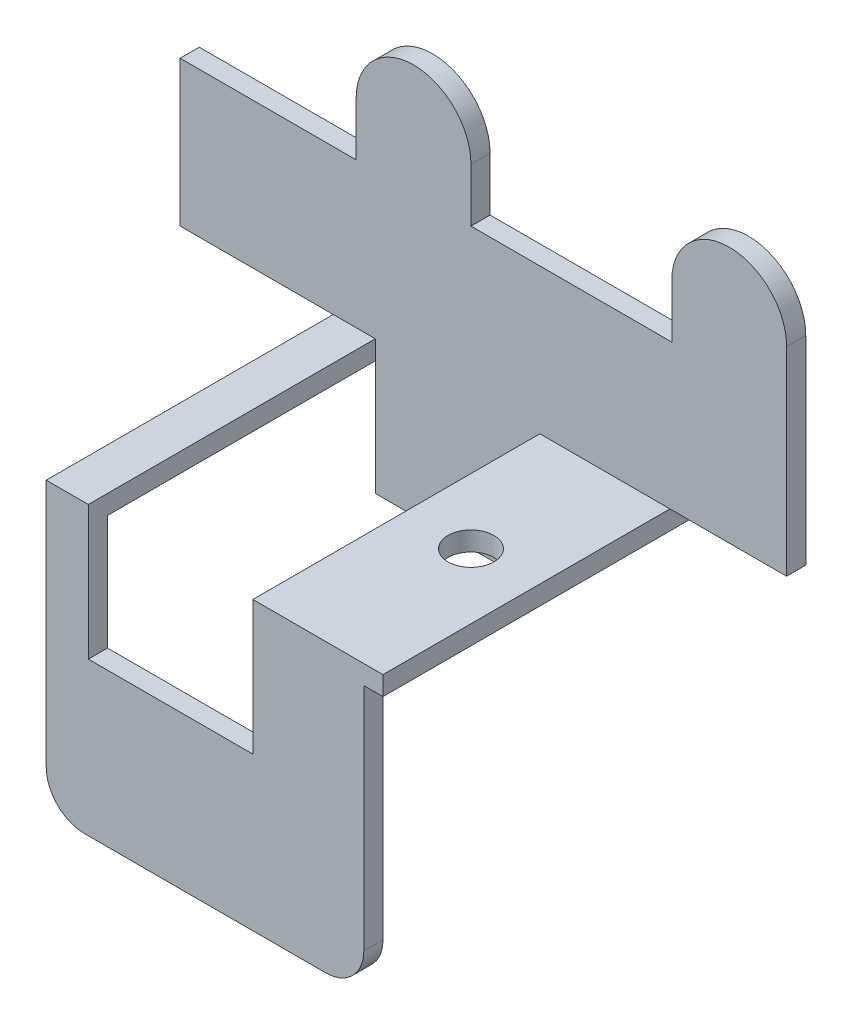
ISO-10303-21;
HEADER;
FILE_DESCRIPTION(('STEP AP214'),'2;1');
FILE_NAME('part.step','',(''),(''),'','','');
FILE_SCHEMA(('AUTOMOTIVE_DESIGN { 1 0 10303 214 1 1 1 1 }'));
ENDSEC;
DATA;
#1=APPLICATION_CONTEXT('core data for automotive mechanical design processes');
#2=APPLICATION_PROTOCOL_DEFINITION('international standard','automotive_design',2000,#1);
#3=PRODUCT_CONTEXT('',#1,'mechanical');
#4=PRODUCT('Part','Part','',(#3));
#5=PRODUCT_RELATED_PRODUCT_CATEGORY('part','',(#4));
#6=PRODUCT_DEFINITION_FORMATION('','',#4);
#7=PRODUCT_DEFINITION_CONTEXT('part definition',#1,'design');
#8=PRODUCT_DEFINITION('design','',#6,#7);
#9=PRODUCT_DEFINITION_SHAPE('','',#8);
#10=(LENGTH_UNIT() NAMED_UNIT(*) SI_UNIT(.MILLI.,.METRE.));
#11=(NAMED_UNIT(*) PLANE_ANGLE_UNIT() SI_UNIT($,.RADIAN.));
#12=(NAMED_UNIT(*) SI_UNIT($,.STERADIAN.) SOLID_ANGLE_UNIT());
#13=UNCERTAINTY_MEASURE_WITH_UNIT(LENGTH_MEASURE(1.E-05),#10,'distance_accuracy_value','');
#14=(GEOMETRIC_REPRESENTATION_CONTEXT(3) GLOBAL_UNCERTAINTY_ASSIGNED_CONTEXT((#13)) GLOBAL_UNIT_ASSIGNED_CONTEXT((#10,
#11,#12)) REPRESENTATION_CONTEXT('',''));
#15=CARTESIAN_POINT('',(0.,0.,0.));
#16=DIRECTION('',(0.,0.,1.));
#17=DIRECTION('',(1.,0.,0.));
#18=AXIS2_PLACEMENT_3D('',#15,#16,#17);
#19=CARTESIAN_POINT('',(23.876,-1.27,20.32));
#20=DIRECTION('',(0.,1.,0.));
#21=DIRECTION('',(0.,0.,1.));
#22=AXIS2_PLACEMENT_3D('',#19,#20,#21);
#23=PLANE('',#22);
#24=CARTESIAN_POINT('',(28.194,-1.27,10.16));
#25=DIRECTION('',(0.,-1.,0.));
#26=DIRECTION('',(0.,0.,-1.));
#27=AXIS2_PLACEMENT_3D('',#24,#25,#26);
#28=CIRCLE('',#27,1.524);
#29=CARTESIAN_POINT('',(28.194,-1.27,8.636));
#30=VERTEX_POINT('',#29);
#31=EDGE_CURVE('E640',#30,#30,#28,.T.);
#32=ORIENTED_EDGE('',*,*,#31,.F.);
#33=EDGE_LOOP('',(#32));
#34=FACE_BOUND('',#33,.T.);
#35=DIRECTION('',(1.,0.,0.));
#36=VECTOR('',#35,1.);
#37=CARTESIAN_POINT('',(23.876,-1.27000000000001,19.05));
#38=LINE('',#37,#36);
#39=CARTESIAN_POINT('',(23.876,-1.27000000000001,19.05));
#40=VERTEX_POINT('',#39);
#41=CARTESIAN_POINT('',(31.242,-1.27000000000001,19.05));
#42=VERTEX_POINT('',#41);
#43=EDGE_CURVE('E273',#40,#42,#38,.T.);
#44=ORIENTED_EDGE('',*,*,#43,.F.);
#45=DIRECTION('',(0.,0.,-1.));
#46=VECTOR('',#45,1.);
#47=CARTESIAN_POINT('',(23.876,-1.27,20.32));
#48=LINE('',#47,#46);
#49=CARTESIAN_POINT('',(23.876,-1.27,1.27));
#50=VERTEX_POINT('',#49);
#51=EDGE_CURVE('E346',#40,#50,#48,.T.);
#52=ORIENTED_EDGE('',*,*,#51,.T.);
#53=CARTESIAN_POINT('',(23.876,-1.27,0.));
#54=VERTEX_POINT('',#53);
#55=EDGE_CURVE('E345',#50,#54,#48,.T.);
#56=ORIENTED_EDGE('',*,*,#55,.T.);
#57=DIRECTION('',(1.,0.,0.));
#58=VECTOR('',#57,1.);
#59=CARTESIAN_POINT('',(23.876,-1.27,0.));
#60=LINE('',#59,#58);
#61=CARTESIAN_POINT('',(32.512,-1.27,0.));
#62=VERTEX_POINT('',#61);
#63=EDGE_CURVE('E326',#54,#62,#60,.T.);
#64=ORIENTED_EDGE('',*,*,#63,.T.);
#65=DIRECTION('',(0.,0.,-1.));
#66=VECTOR('',#65,1.);
#67=CARTESIAN_POINT('',(32.512,-1.27,20.32));
#68=LINE('',#67,#66);
#69=CARTESIAN_POINT('',(32.512,-1.27,20.32));
#70=VERTEX_POINT('',#69);
#71=EDGE_CURVE('E342',#70,#62,#68,.T.);
#72=ORIENTED_EDGE('',*,*,#71,.F.);
#73=DIRECTION('',(1.,0.,0.));
#74=VECTOR('',#73,1.);
#75=CARTESIAN_POINT('',(23.876,-1.27,20.32));
#76=LINE('',#75,#74);
#77=CARTESIAN_POINT('',(31.242,-1.27,20.32));
#78=VERTEX_POINT('',#77);
#79=EDGE_CURVE('E283',#78,#70,#76,.T.);
#80=ORIENTED_EDGE('',*,*,#79,.F.);
#81=DIRECTION('',(0.,0.,1.));
#82=VECTOR('',#81,1.);
#83=CARTESIAN_POINT('',(31.242,-1.27000000000001,20.32));
#84=LINE('',#83,#82);
#85=EDGE_CURVE('E232',#42,#78,#84,.T.);
#86=ORIENTED_EDGE('',*,*,#85,.F.);
#87=EDGE_LOOP('',(#44,#52,#56,#64,#72,#80,#86));
#88=FACE_BOUND('',#87,.T.);
#89=ADVANCED_FACE('F32',(#34,#88),#23,.F.);
#90=CARTESIAN_POINT('',(12.954,-1.27,20.32));
#91=DIRECTION('',(0.,1.,0.));
#92=DIRECTION('',(-1.,0.,0.));
#93=AXIS2_PLACEMENT_3D('',#90,#91,#92);
#94=PLANE('',#93);
#95=DIRECTION('',(1.,0.,0.));
#96=VECTOR('',#95,1.);
#97=CARTESIAN_POINT('',(10.16,-1.27,19.05));
#98=LINE('',#97,#96);
#99=CARTESIAN_POINT('',(10.16,-1.27,19.05));
#100=VERTEX_POINT('',#99);
#101=CARTESIAN_POINT('',(12.954,-1.27,19.05));
#102=VERTEX_POINT('',#101);
#103=EDGE_CURVE('E292',#100,#102,#98,.T.);
#104=ORIENTED_EDGE('',*,*,#103,.F.);
#105=DIRECTION('',(0.,0.,-1.));
#106=VECTOR('',#105,1.);
#107=CARTESIAN_POINT('',(10.16,-1.27,20.32));
#108=LINE('',#107,#106);
#109=CARTESIAN_POINT('',(10.16,-1.27,0.));
#110=VERTEX_POINT('',#109);
#111=EDGE_CURVE('E314',#100,#110,#108,.T.);
#112=ORIENTED_EDGE('',*,*,#111,.T.);
#113=DIRECTION('',(1.,0.,0.));
#114=VECTOR('',#113,1.);
#115=CARTESIAN_POINT('',(12.954,-1.27,0.));
#116=LINE('',#115,#114);
#117=CARTESIAN_POINT('',(12.954,-1.27,0.));
#118=VERTEX_POINT('',#117);
#119=EDGE_CURVE('E310',#110,#118,#116,.T.);
#120=ORIENTED_EDGE('',*,*,#119,.T.);
#121=DIRECTION('',(0.,0.,-1.));
#122=VECTOR('',#121,1.);
#123=CARTESIAN_POINT('',(12.954,-1.27,20.32));
#124=LINE('',#123,#122);
#125=CARTESIAN_POINT('',(12.954,-1.27,1.27));
#126=VERTEX_POINT('',#125);
#127=EDGE_CURVE('E307',#126,#118,#124,.T.);
#128=ORIENTED_EDGE('',*,*,#127,.F.);
#129=EDGE_CURVE('E57',#102,#126,#124,.T.);
#130=ORIENTED_EDGE('',*,*,#129,.F.);
#131=EDGE_LOOP('',(#104,#112,#120,#128,#130));
#132=FACE_BOUND('',#131,.T.);
#133=ADVANCED_FACE('F480',(#132),#94,.F.);
#134=CARTESIAN_POINT('',(12.954,0.,1.27));
#135=DIRECTION('',(0.,1.,0.));
#136=DIRECTION('',(-1.,0.,0.));
#137=AXIS2_PLACEMENT_3D('',#134,#135,#136);
#138=PLANE('',#137);
#139=DIRECTION('',(0.,0.,-1.));
#140=VECTOR('',#139,1.);
#141=CARTESIAN_POINT('',(10.16,0.,20.32));
#142=LINE('',#141,#140);
#143=CARTESIAN_POINT('',(10.16,0.,1.27));
#144=VERTEX_POINT('',#143);
#145=CARTESIAN_POINT('',(10.16,0.,0.));
#146=VERTEX_POINT('',#145);
#147=EDGE_CURVE('E316',#144,#146,#142,.T.);
#148=ORIENTED_EDGE('',*,*,#147,.F.);
#149=DIRECTION('',(1.,0.,0.));
#150=VECTOR('',#149,1.);
#151=CARTESIAN_POINT('',(12.954,0.,1.27));
#152=LINE('',#151,#150);
#153=CARTESIAN_POINT('',(0.,0.,1.27));
#154=VERTEX_POINT('',#153);
#155=EDGE_CURVE('E352',#154,#144,#152,.T.);
#156=ORIENTED_EDGE('',*,*,#155,.F.);
#157=DIRECTION('',(0.,0.,-1.));
#158=VECTOR('',#157,1.);
#159=CARTESIAN_POINT('',(0.,0.,1.27));
#160=LINE('',#159,#158);
#161=CARTESIAN_POINT('',(0.,0.,0.));
#162=VERTEX_POINT('',#161);
#163=EDGE_CURVE('E387',#154,#162,#160,.T.);
#164=ORIENTED_EDGE('',*,*,#163,.T.);
#165=DIRECTION('',(1.,0.,0.));
#166=VECTOR('',#165,1.);
#167=CARTESIAN_POINT('',(12.954,0.,0.));
#168=LINE('',#167,#166);
#169=EDGE_CURVE('E351',#162,#146,#168,.T.);
#170=ORIENTED_EDGE('',*,*,#169,.T.);
#171=EDGE_LOOP('',(#148,#156,#164,#170));
#172=FACE_BOUND('',#171,.T.);
#173=ADVANCED_FACE('F34',(#172),#138,.F.);
#174=CARTESIAN_POINT('',(12.954,-8.89,1.27));
#175=DIRECTION('',(1.,0.,0.));
#176=DIRECTION('',(0.,0.,-1.));
#177=AXIS2_PLACEMENT_3D('',#174,#175,#176);
#178=PLANE('',#177);
#179=ORIENTED_EDGE('',*,*,#127,.T.);
#180=DIRECTION('',(0.,-1.,0.));
#181=VECTOR('',#180,1.);
#182=CARTESIAN_POINT('',(12.954,-8.89,0.));
#183=LINE('',#182,#181);
#184=CARTESIAN_POINT('',(12.954,-8.89,0.));
#185=VERTEX_POINT('',#184);
#186=EDGE_CURVE('E389',#118,#185,#183,.T.);
#187=ORIENTED_EDGE('',*,*,#186,.T.);
#188=DIRECTION('',(0.,0.,-1.));
#189=VECTOR('',#188,1.);
#190=CARTESIAN_POINT('',(12.954,-8.89,1.27));
#191=LINE('',#190,#189);
#192=CARTESIAN_POINT('',(12.954,-8.89,1.27));
#193=VERTEX_POINT('',#192);
#194=EDGE_CURVE('E11',#193,#185,#191,.T.);
#195=ORIENTED_EDGE('',*,*,#194,.F.);
#196=DIRECTION('',(0.,-1.,0.));
#197=VECTOR('',#196,1.);
#198=CARTESIAN_POINT('',(12.954,-8.89,1.27));
#199=LINE('',#198,#197);
#200=EDGE_CURVE('E355',#126,#193,#199,.T.);
#201=ORIENTED_EDGE('',*,*,#200,.F.);
#202=EDGE_LOOP('',(#179,#187,#195,#201));
#203=FACE_BOUND('',#202,.T.);
#204=ADVANCED_FACE('F549',(#203),#178,.F.);
#205=CARTESIAN_POINT('',(23.876,0.,1.27));
#206=DIRECTION('',(-1.,0.,0.));
#207=DIRECTION('',(0.,0.,1.));
#208=AXIS2_PLACEMENT_3D('',#205,#206,#207);
#209=PLANE('',#208);
#210=ORIENTED_EDGE('',*,*,#55,.F.);
#211=DIRECTION('',(0.,1.,0.));
#212=VECTOR('',#211,1.);
#213=CARTESIAN_POINT('',(23.876,0.,1.27));
#214=LINE('',#213,#212);
#215=CARTESIAN_POINT('',(23.876,-8.89,1.27));
#216=VERTEX_POINT('',#215);
#217=EDGE_CURVE('E362',#216,#50,#214,.T.);
#218=ORIENTED_EDGE('',*,*,#217,.F.);
#219=DIRECTION('',(0.,0.,-1.));
#220=VECTOR('',#219,1.);
#221=CARTESIAN_POINT('',(23.876,-8.89,1.27));
#222=LINE('',#221,#220);
#223=CARTESIAN_POINT('',(23.876,-8.89,0.));
#224=VERTEX_POINT('',#223);
#225=EDGE_CURVE('E41',#216,#224,#222,.T.);
#226=ORIENTED_EDGE('',*,*,#225,.T.);
#227=DIRECTION('',(0.,1.,0.));
#228=VECTOR('',#227,1.);
#229=CARTESIAN_POINT('',(23.876,0.,0.));
#230=LINE('',#229,#228);
#231=EDGE_CURVE('E393',#224,#54,#230,.T.);
#232=ORIENTED_EDGE('',*,*,#231,.T.);
#233=EDGE_LOOP('',(#210,#218,#226,#232));
#234=FACE_BOUND('',#233,.T.);
#235=ADVANCED_FACE('F545',(#234),#209,.F.);
#236=CARTESIAN_POINT('',(40.259,0.,1.27));
#237=DIRECTION('',(0.,1.,0.));
#238=DIRECTION('',(-1.,0.,0.));
#239=AXIS2_PLACEMENT_3D('',#236,#237,#238);
#240=PLANE('',#239);
#241=DIRECTION('',(0.,0.,-1.));
#242=VECTOR('',#241,1.);
#243=CARTESIAN_POINT('',(32.512,0.,20.32));
#244=LINE('',#243,#242);
#245=CARTESIAN_POINT('',(32.512,0.,1.27));
#246=VERTEX_POINT('',#245);
#247=CARTESIAN_POINT('',(32.512,0.,0.));
#248=VERTEX_POINT('',#247);
#249=EDGE_CURVE('E338',#246,#248,#244,.T.);
#250=ORIENTED_EDGE('',*,*,#249,.T.);
#251=DIRECTION('',(1.,0.,0.));
#252=VECTOR('',#251,1.);
#253=CARTESIAN_POINT('',(40.259,0.,0.));
#254=LINE('',#253,#252);
#255=CARTESIAN_POINT('',(40.259,0.,0.));
#256=VERTEX_POINT('',#255);
#257=EDGE_CURVE('E395',#248,#256,#254,.T.);
#258=ORIENTED_EDGE('',*,*,#257,.T.);
#259=DIRECTION('',(0.,0.,-1.));
#260=VECTOR('',#259,1.);
#261=CARTESIAN_POINT('',(40.259,0.,1.27));
#262=LINE('',#261,#260);
#263=CARTESIAN_POINT('',(40.259,0.,1.27));
#264=VERTEX_POINT('',#263);
#265=EDGE_CURVE('E440',#264,#256,#262,.T.);
#266=ORIENTED_EDGE('',*,*,#265,.F.);
#267=DIRECTION('',(1.,0.,0.));
#268=VECTOR('',#267,1.);
#269=CARTESIAN_POINT('',(40.259,0.,1.27));
#270=LINE('',#269,#268);
#271=EDGE_CURVE('E365',#246,#264,#270,.T.);
#272=ORIENTED_EDGE('',*,*,#271,.F.);
#273=EDGE_LOOP('',(#250,#258,#266,#272));
#274=FACE_BOUND('',#273,.T.);
#275=ADVANCED_FACE('F542',(#274),#240,.F.);
#276=CARTESIAN_POINT('',(23.876,-8.89,1.27));
#277=DIRECTION('',(0.,1.,0.));
#278=DIRECTION('',(-1.,0.,0.));
#279=AXIS2_PLACEMENT_3D('',#276,#277,#278);
#280=PLANE('',#279);
#281=DIRECTION('',(1.,0.,0.));
#282=VECTOR('',#281,1.);
#283=CARTESIAN_POINT('',(23.876,-8.89,0.));
#284=LINE('',#283,#282);
#285=EDGE_CURVE('E391',#185,#224,#284,.T.);
#286=ORIENTED_EDGE('',*,*,#285,.T.);
#287=ORIENTED_EDGE('',*,*,#225,.F.);
#288=DIRECTION('',(1.,0.,0.));
#289=VECTOR('',#288,1.);
#290=CARTESIAN_POINT('',(23.876,-8.89,1.27));
#291=LINE('',#290,#289);
#292=EDGE_CURVE('E360',#193,#216,#291,.T.);
#293=ORIENTED_EDGE('',*,*,#292,.F.);
#294=ORIENTED_EDGE('',*,*,#194,.T.);
#295=EDGE_LOOP('',(#286,#287,#293,#294));
#296=FACE_BOUND('',#295,.T.);
#297=ADVANCED_FACE('F540',(#296),#280,.F.);
#298=CARTESIAN_POINT('',(40.259,13.208,1.27));
#299=DIRECTION('',(-1.,0.,0.));
#300=DIRECTION('',(0.,-1.,0.));
#301=AXIS2_PLACEMENT_3D('',#298,#299,#300);
#302=PLANE('',#301);
#303=DIRECTION('',(0.,1.,0.));
#304=VECTOR('',#303,1.);
#305=CARTESIAN_POINT('',(40.259,13.208,0.));
#306=LINE('',#305,#304);
#307=CARTESIAN_POINT('',(40.259,13.208,0.));
#308=VERTEX_POINT('',#307);
#309=EDGE_CURVE('E397',#256,#308,#306,.T.);
#310=ORIENTED_EDGE('',*,*,#309,.T.);
#311=DIRECTION('',(0.,0.,-1.));
#312=VECTOR('',#311,1.);
#313=CARTESIAN_POINT('',(40.259,13.208,1.27));
#314=LINE('',#313,#312);
#315=CARTESIAN_POINT('',(40.259,13.208,1.27));
#316=VERTEX_POINT('',#315);
#317=EDGE_CURVE('E437',#316,#308,#314,.T.);
#318=ORIENTED_EDGE('',*,*,#317,.F.);
#319=DIRECTION('',(0.,1.,0.));
#320=VECTOR('',#319,1.);
#321=CARTESIAN_POINT('',(40.259,9.652,1.27));
#322=LINE('',#321,#320);
#323=EDGE_CURVE('E369',#264,#316,#322,.T.);
#324=ORIENTED_EDGE('',*,*,#323,.F.);
#325=ORIENTED_EDGE('',*,*,#265,.T.);
#326=EDGE_LOOP('',(#310,#318,#324,#325));
#327=FACE_BOUND('',#326,.T.);
#328=ADVANCED_FACE('F536',(#327),#302,.F.);
#329=CARTESIAN_POINT('',(36.449,13.208,1.27));
#330=DIRECTION('',(0.,0.,-1.));
#331=DIRECTION('',(-1.,0.,0.));
#332=AXIS2_PLACEMENT_3D('',#329,#330,#331);
#333=CYLINDRICAL_SURFACE('',#332,3.81);
#334=CARTESIAN_POINT('',(36.449,13.208,0.));
#335=DIRECTION('',(0.,0.,1.));
#336=DIRECTION('',(1.,0.,0.));
#337=AXIS2_PLACEMENT_3D('',#334,#335,#336);
#338=CIRCLE('',#337,3.81);
#339=CARTESIAN_POINT('',(32.639,13.208,0.));
#340=VERTEX_POINT('',#339);
#341=EDGE_CURVE('E399',#308,#340,#338,.T.);
#342=ORIENTED_EDGE('',*,*,#341,.T.);
#343=DIRECTION('',(0.,0.,-1.));
#344=VECTOR('',#343,1.);
#345=CARTESIAN_POINT('',(32.639,13.208,1.27));
#346=LINE('',#345,#344);
#347=CARTESIAN_POINT('',(32.639,13.208,1.27));
#348=VERTEX_POINT('',#347);
#349=EDGE_CURVE('E434',#348,#340,#346,.T.);
#350=ORIENTED_EDGE('',*,*,#349,.F.);
#351=CARTESIAN_POINT('',(36.449,13.208,1.27));
#352=DIRECTION('',(0.,0.,1.));
#353=DIRECTION('',(1.,0.,0.));
#354=AXIS2_PLACEMENT_3D('',#351,#352,#353);
#355=CIRCLE('',#354,3.81);
#356=EDGE_CURVE('E371',#316,#348,#355,.T.);
#357=ORIENTED_EDGE('',*,*,#356,.F.);
#358=ORIENTED_EDGE('',*,*,#317,.T.);
#359=EDGE_LOOP('',(#342,#350,#357,#358));
#360=FACE_BOUND('',#359,.T.);
#361=ADVANCED_FACE('F532',(#360),#333,.T.);
#362=CARTESIAN_POINT('',(32.639,13.208,1.27));
#363=DIRECTION('',(1.,0.,0.));
#364=DIRECTION('',(0.,0.,-1.));
#365=AXIS2_PLACEMENT_3D('',#362,#363,#364);
#366=PLANE('',#365);
#367=DIRECTION('',(0.,-1.,0.));
#368=VECTOR('',#367,1.);
#369=CARTESIAN_POINT('',(32.639,13.208,0.));
#370=LINE('',#369,#368);
#371=CARTESIAN_POINT('',(32.639,9.652,0.));
#372=VERTEX_POINT('',#371);
#373=EDGE_CURVE('E401',#340,#372,#370,.T.);
#374=ORIENTED_EDGE('',*,*,#373,.T.);
#375=DIRECTION('',(0.,0.,-1.));
#376=VECTOR('',#375,1.);
#377=CARTESIAN_POINT('',(32.639,9.652,1.27));
#378=LINE('',#377,#376);
#379=CARTESIAN_POINT('',(32.639,9.652,1.27));
#380=VERTEX_POINT('',#379);
#381=EDGE_CURVE('E431',#380,#372,#378,.T.);
#382=ORIENTED_EDGE('',*,*,#381,.F.);
#383=DIRECTION('',(0.,-1.,0.));
#384=VECTOR('',#383,1.);
#385=CARTESIAN_POINT('',(32.639,13.208,1.27));
#386=LINE('',#385,#384);
#387=EDGE_CURVE('E373',#348,#380,#386,.T.);
#388=ORIENTED_EDGE('',*,*,#387,.F.);
#389=ORIENTED_EDGE('',*,*,#349,.T.);
#390=EDGE_LOOP('',(#374,#382,#388,#389));
#391=FACE_BOUND('',#390,.T.);
#392=ADVANCED_FACE('F528',(#391),#366,.F.);
#393=CARTESIAN_POINT('',(19.304,9.652,1.27));
#394=DIRECTION('',(0.,-1.,0.));
#395=DIRECTION('',(0.,0.,-1.));
#396=AXIS2_PLACEMENT_3D('',#393,#394,#395);
#397=PLANE('',#396);
#398=DIRECTION('',(-1.,0.,0.));
#399=VECTOR('',#398,1.);
#400=CARTESIAN_POINT('',(19.304,9.652,0.));
#401=LINE('',#400,#399);
#402=CARTESIAN_POINT('',(19.304,9.652,0.));
#403=VERTEX_POINT('',#402);
#404=EDGE_CURVE('E403',#372,#403,#401,.T.);
#405=ORIENTED_EDGE('',*,*,#404,.T.);
#406=DIRECTION('',(0.,0.,-1.));
#407=VECTOR('',#406,1.);
#408=CARTESIAN_POINT('',(19.304,9.652,1.27));
#409=LINE('',#408,#407);
#410=CARTESIAN_POINT('',(19.304,9.652,1.27));
#411=VERTEX_POINT('',#410);
#412=EDGE_CURVE('E428',#411,#403,#409,.T.);
#413=ORIENTED_EDGE('',*,*,#412,.F.);
#414=DIRECTION('',(-1.,0.,0.));
#415=VECTOR('',#414,1.);
#416=CARTESIAN_POINT('',(19.304,9.652,1.27));
#417=LINE('',#416,#415);
#418=EDGE_CURVE('E375',#380,#411,#417,.T.);
#419=ORIENTED_EDGE('',*,*,#418,.F.);
#420=ORIENTED_EDGE('',*,*,#381,.T.);
#421=EDGE_LOOP('',(#405,#413,#419,#420));
#422=FACE_BOUND('',#421,.T.);
#423=ADVANCED_FACE('F524',(#422),#397,.F.);
#424=CARTESIAN_POINT('',(19.304,13.208,1.27));
#425=DIRECTION('',(-1.,0.,0.));
#426=DIRECTION('',(0.,0.,1.));
#427=AXIS2_PLACEMENT_3D('',#424,#425,#426);
#428=PLANE('',#427);
#429=DIRECTION('',(0.,1.,0.));
#430=VECTOR('',#429,1.);
#431=CARTESIAN_POINT('',(19.304,13.208,0.));
#432=LINE('',#431,#430);
#433=CARTESIAN_POINT('',(19.304,13.208,0.));
#434=VERTEX_POINT('',#433);
#435=EDGE_CURVE('E405',#403,#434,#432,.T.);
#436=ORIENTED_EDGE('',*,*,#435,.T.);
#437=DIRECTION('',(0.,0.,-1.));
#438=VECTOR('',#437,1.);
#439=CARTESIAN_POINT('',(19.304,13.208,1.27));
#440=LINE('',#439,#438);
#441=CARTESIAN_POINT('',(19.304,13.208,1.27));
#442=VERTEX_POINT('',#441);
#443=EDGE_CURVE('E425',#442,#434,#440,.T.);
#444=ORIENTED_EDGE('',*,*,#443,.F.);
#445=DIRECTION('',(0.,1.,0.));
#446=VECTOR('',#445,1.);
#447=CARTESIAN_POINT('',(19.304,13.208,1.27));
#448=LINE('',#447,#446);
#449=EDGE_CURVE('E377',#411,#442,#448,.T.);
#450=ORIENTED_EDGE('',*,*,#449,.F.);
#451=ORIENTED_EDGE('',*,*,#412,.T.);
#452=EDGE_LOOP('',(#436,#444,#450,#451));
#453=FACE_BOUND('',#452,.T.);
#454=ADVANCED_FACE('F520',(#453),#428,.F.);
#455=CARTESIAN_POINT('',(15.494,13.208,1.27));
#456=DIRECTION('',(0.,0.,-1.));
#457=DIRECTION('',(-1.,0.,0.));
#458=AXIS2_PLACEMENT_3D('',#455,#456,#457);
#459=CYLINDRICAL_SURFACE('',#458,3.81);
#460=CARTESIAN_POINT('',(15.494,13.208,0.));
#461=DIRECTION('',(0.,0.,1.));
#462=DIRECTION('',(-1.,0.,0.));
#463=AXIS2_PLACEMENT_3D('',#460,#461,#462);
#464=CIRCLE('',#463,3.81);
#465=CARTESIAN_POINT('',(11.684,13.208,0.));
#466=VERTEX_POINT('',#465);
#467=EDGE_CURVE('E407',#434,#466,#464,.T.);
#468=ORIENTED_EDGE('',*,*,#467,.T.);
#469=DIRECTION('',(0.,0.,-1.));
#470=VECTOR('',#469,1.);
#471=CARTESIAN_POINT('',(11.684,13.208,1.27));
#472=LINE('',#471,#470);
#473=CARTESIAN_POINT('',(11.684,13.208,1.27));
#474=VERTEX_POINT('',#473);
#475=EDGE_CURVE('E422',#474,#466,#472,.T.);
#476=ORIENTED_EDGE('',*,*,#475,.F.);
#477=CARTESIAN_POINT('',(15.494,13.208,1.27));
#478=DIRECTION('',(0.,0.,1.));
#479=DIRECTION('',(-1.,0.,0.));
#480=AXIS2_PLACEMENT_3D('',#477,#478,#479);
#481=CIRCLE('',#480,3.81);
#482=EDGE_CURVE('E379',#442,#474,#481,.T.);
#483=ORIENTED_EDGE('',*,*,#482,.F.);
#484=ORIENTED_EDGE('',*,*,#443,.T.);
#485=EDGE_LOOP('',(#468,#476,#483,#484));
#486=FACE_BOUND('',#485,.T.);
#487=ADVANCED_FACE('F516',(#486),#459,.T.);
#488=CARTESIAN_POINT('',(11.684,9.652,1.27));
#489=DIRECTION('',(1.,0.,0.));
#490=DIRECTION('',(0.,0.,-1.));
#491=AXIS2_PLACEMENT_3D('',#488,#489,#490);
#492=PLANE('',#491);
#493=DIRECTION('',(0.,-1.,0.));
#494=VECTOR('',#493,1.);
#495=CARTESIAN_POINT('',(11.684,9.652,0.));
#496=LINE('',#495,#494);
#497=CARTESIAN_POINT('',(11.684,9.652,0.));
#498=VERTEX_POINT('',#497);
#499=EDGE_CURVE('E409',#466,#498,#496,.T.);
#500=ORIENTED_EDGE('',*,*,#499,.T.);
#501=DIRECTION('',(0.,0.,-1.));
#502=VECTOR('',#501,1.);
#503=CARTESIAN_POINT('',(11.684,9.652,1.27));
#504=LINE('',#503,#502);
#505=CARTESIAN_POINT('',(11.684,9.652,1.27));
#506=VERTEX_POINT('',#505);
#507=EDGE_CURVE('E419',#506,#498,#504,.T.);
#508=ORIENTED_EDGE('',*,*,#507,.F.);
#509=DIRECTION('',(0.,-1.,0.));
#510=VECTOR('',#509,1.);
#511=CARTESIAN_POINT('',(11.684,9.652,1.27));
#512=LINE('',#511,#510);
#513=EDGE_CURVE('E381',#474,#506,#512,.T.);
#514=ORIENTED_EDGE('',*,*,#513,.F.);
#515=ORIENTED_EDGE('',*,*,#475,.T.);
#516=EDGE_LOOP('',(#500,#508,#514,#515));
#517=FACE_BOUND('',#516,.T.);
#518=ADVANCED_FACE('F512',(#517),#492,.F.);
#519=CARTESIAN_POINT('',(0.,9.652,1.27));
#520=DIRECTION('',(0.,-1.,0.));
#521=DIRECTION('',(0.,0.,-1.));
#522=AXIS2_PLACEMENT_3D('',#519,#520,#521);
#523=PLANE('',#522);
#524=DIRECTION('',(-1.,0.,0.));
#525=VECTOR('',#524,1.);
#526=CARTESIAN_POINT('',(0.,9.652,0.));
#527=LINE('',#526,#525);
#528=CARTESIAN_POINT('',(0.,9.652,0.));
#529=VERTEX_POINT('',#528);
#530=EDGE_CURVE('E411',#498,#529,#527,.T.);
#531=ORIENTED_EDGE('',*,*,#530,.T.);
#532=DIRECTION('',(0.,0.,-1.));
#533=VECTOR('',#532,1.);
#534=CARTESIAN_POINT('',(0.,9.652,1.27));
#535=LINE('',#534,#533);
#536=CARTESIAN_POINT('',(0.,9.652,1.27));
#537=VERTEX_POINT('',#536);
#538=EDGE_CURVE('E416',#537,#529,#535,.T.);
#539=ORIENTED_EDGE('',*,*,#538,.F.);
#540=DIRECTION('',(-1.,0.,0.));
#541=VECTOR('',#540,1.);
#542=CARTESIAN_POINT('',(0.,9.652,1.27));
#543=LINE('',#542,#541);
#544=EDGE_CURVE('E383',#506,#537,#543,.T.);
#545=ORIENTED_EDGE('',*,*,#544,.F.);
#546=ORIENTED_EDGE('',*,*,#507,.T.);
#547=EDGE_LOOP('',(#531,#539,#545,#546));
#548=FACE_BOUND('',#547,.T.);
#549=ADVANCED_FACE('F508',(#548),#523,.F.);
#550=CARTESIAN_POINT('',(0.,0.,1.27));
#551=DIRECTION('',(1.,0.,0.));
#552=DIRECTION('',(0.,0.,-1.));
#553=AXIS2_PLACEMENT_3D('',#550,#551,#552);
#554=PLANE('',#553);
#555=DIRECTION('',(0.,-1.,0.));
#556=VECTOR('',#555,1.);
#557=CARTESIAN_POINT('',(0.,0.,0.));
#558=LINE('',#557,#556);
#559=EDGE_CURVE('E356',#529,#162,#558,.T.);
#560=ORIENTED_EDGE('',*,*,#559,.T.);
#561=ORIENTED_EDGE('',*,*,#163,.F.);
#562=DIRECTION('',(0.,-1.,0.));
#563=VECTOR('',#562,1.);
#564=CARTESIAN_POINT('',(0.,0.,1.27));
#565=LINE('',#564,#563);
#566=EDGE_CURVE('E385',#537,#154,#565,.T.);
#567=ORIENTED_EDGE('',*,*,#566,.F.);
#568=ORIENTED_EDGE('',*,*,#538,.T.);
#569=EDGE_LOOP('',(#560,#561,#567,#568));
#570=FACE_BOUND('',#569,.T.);
#571=ADVANCED_FACE('F501',(#570),#554,.F.);
#572=CARTESIAN_POINT('',(15.494,13.208,1.27));
#573=DIRECTION('',(0.,0.,-1.));
#574=DIRECTION('',(-1.,0.,0.));
#575=AXIS2_PLACEMENT_3D('',#572,#573,#574);
#576=PLANE('',#575);
#577=ORIENTED_EDGE('',*,*,#155,.T.);
#578=DIRECTION('',(-1.,0.,0.));
#579=VECTOR('',#578,1.);
#580=CARTESIAN_POINT('',(15.494,0.,1.27));
#581=LINE('',#580,#579);
#582=CARTESIAN_POINT('',(12.954,0.,1.27));
#583=VERTEX_POINT('',#582);
#584=EDGE_CURVE('E323',#583,#144,#581,.T.);
#585=ORIENTED_EDGE('',*,*,#584,.F.);
#586=EDGE_CURVE('E357',#583,#126,#199,.T.);
#587=ORIENTED_EDGE('',*,*,#586,.T.);
#588=ORIENTED_EDGE('',*,*,#200,.T.);
#589=ORIENTED_EDGE('',*,*,#292,.T.);
#590=ORIENTED_EDGE('',*,*,#217,.T.);
#591=DIRECTION('',(0.,-1.,0.));
#592=VECTOR('',#591,1.);
#593=CARTESIAN_POINT('',(23.876,13.208,1.27));
#594=LINE('',#593,#592);
#595=CARTESIAN_POINT('',(23.876,0.,1.27));
#596=VERTEX_POINT('',#595);
#597=EDGE_CURVE('E348',#596,#50,#594,.T.);
#598=ORIENTED_EDGE('',*,*,#597,.F.);
#599=EDGE_CURVE('E366',#596,#246,#270,.T.);
#600=ORIENTED_EDGE('',*,*,#599,.T.);
#601=ORIENTED_EDGE('',*,*,#271,.T.);
#602=ORIENTED_EDGE('',*,*,#323,.T.);
#603=ORIENTED_EDGE('',*,*,#356,.T.);
#604=ORIENTED_EDGE('',*,*,#387,.T.);
#605=ORIENTED_EDGE('',*,*,#418,.T.);
#606=ORIENTED_EDGE('',*,*,#449,.T.);
#607=ORIENTED_EDGE('',*,*,#482,.T.);
#608=ORIENTED_EDGE('',*,*,#513,.T.);
#609=ORIENTED_EDGE('',*,*,#544,.T.);
#610=ORIENTED_EDGE('',*,*,#566,.T.);
#611=EDGE_LOOP('',(#577,#585,#587,#588,#589,#590,#598,#600,#601,#602,#603,#604,#605,#606,#607,
#608,#609,#610));
#612=FACE_BOUND('',#611,.T.);
#613=ADVANCED_FACE('F498',(#612),#576,.F.);
#614=CARTESIAN_POINT('',(15.494,13.208,0.));
#615=DIRECTION('',(0.,0.,-1.));
#616=DIRECTION('',(-1.,0.,0.));
#617=AXIS2_PLACEMENT_3D('',#614,#615,#616);
#618=PLANE('',#617);
#619=ORIENTED_EDGE('',*,*,#186,.F.);
#620=ORIENTED_EDGE('',*,*,#119,.F.);
#621=DIRECTION('',(0.,-1.,0.));
#622=VECTOR('',#621,1.);
#623=CARTESIAN_POINT('',(10.16,0.,0.));
#624=LINE('',#623,#622);
#625=EDGE_CURVE('E302',#146,#110,#624,.T.);
#626=ORIENTED_EDGE('',*,*,#625,.F.);
#627=ORIENTED_EDGE('',*,*,#169,.F.);
#628=ORIENTED_EDGE('',*,*,#559,.F.);
#629=ORIENTED_EDGE('',*,*,#530,.F.);
#630=ORIENTED_EDGE('',*,*,#499,.F.);
#631=ORIENTED_EDGE('',*,*,#467,.F.);
#632=ORIENTED_EDGE('',*,*,#435,.F.);
#633=ORIENTED_EDGE('',*,*,#404,.F.);
#634=ORIENTED_EDGE('',*,*,#373,.F.);
#635=ORIENTED_EDGE('',*,*,#341,.F.);
#636=ORIENTED_EDGE('',*,*,#309,.F.);
#637=ORIENTED_EDGE('',*,*,#257,.F.);
#638=DIRECTION('',(0.,1.,0.));
#639=VECTOR('',#638,1.);
#640=CARTESIAN_POINT('',(32.512,0.,0.));
#641=LINE('',#640,#639);
#642=EDGE_CURVE('E284',#62,#248,#641,.T.);
#643=ORIENTED_EDGE('',*,*,#642,.F.);
#644=ORIENTED_EDGE('',*,*,#63,.F.);
#645=ORIENTED_EDGE('',*,*,#231,.F.);
#646=ORIENTED_EDGE('',*,*,#285,.F.);
#647=EDGE_LOOP('',(#619,#620,#626,#627,#628,#629,#630,#631,#632,#633,#634,#635,#636,#637,#643,
#644,#645,#646));
#648=FACE_BOUND('',#647,.T.);
#649=ADVANCED_FACE('F496',(#648),#618,.T.);
#650=CARTESIAN_POINT('',(23.876,0.,20.32));
#651=DIRECTION('',(1.,0.,0.));
#652=DIRECTION('',(0.,0.,-1.));
#653=AXIS2_PLACEMENT_3D('',#650,#651,#652);
#654=PLANE('',#653);
#655=DIRECTION('',(0.,0.,-1.));
#656=VECTOR('',#655,1.);
#657=CARTESIAN_POINT('',(23.876,0.,20.32));
#658=LINE('',#657,#656);
#659=CARTESIAN_POINT('',(23.876,0.,20.32));
#660=VERTEX_POINT('',#659);
#661=EDGE_CURVE('E332',#660,#596,#658,.T.);
#662=ORIENTED_EDGE('',*,*,#661,.T.);
#663=ORIENTED_EDGE('',*,*,#597,.T.);
#664=ORIENTED_EDGE('',*,*,#51,.F.);
#665=DIRECTION('',(0.,1.,0.));
#666=VECTOR('',#665,1.);
#667=CARTESIAN_POINT('',(23.876,-8.89000000000001,19.05));
#668=LINE('',#667,#666);
#669=CARTESIAN_POINT('',(23.876,-8.89,19.05));
#670=VERTEX_POINT('',#669);
#671=EDGE_CURVE('E299',#670,#40,#668,.T.);
#672=ORIENTED_EDGE('',*,*,#671,.F.);
#673=DIRECTION('',(0.,0.,-1.));
#674=VECTOR('',#673,1.);
#675=CARTESIAN_POINT('',(23.876,-8.89000000000001,20.32));
#676=LINE('',#675,#674);
#677=CARTESIAN_POINT('',(23.876,-8.89000000000001,20.32));
#678=VERTEX_POINT('',#677);
#679=EDGE_CURVE('E235',#678,#670,#676,.T.);
#680=ORIENTED_EDGE('',*,*,#679,.F.);
#681=DIRECTION('',(0.,-1.,0.));
#682=VECTOR('',#681,1.);
#683=CARTESIAN_POINT('',(23.876,0.,20.32));
#684=LINE('',#683,#682);
#685=EDGE_CURVE('E281',#660,#678,#684,.T.);
#686=ORIENTED_EDGE('',*,*,#685,.F.);
#687=EDGE_LOOP('',(#662,#663,#664,#672,#680,#686));
#688=FACE_BOUND('',#687,.T.);
#689=ADVANCED_FACE('F492',(#688),#654,.F.);
#690=CARTESIAN_POINT('',(23.876,0.,20.32));
#691=DIRECTION('',(0.,-1.,0.));
#692=DIRECTION('',(1.,0.,0.));
#693=AXIS2_PLACEMENT_3D('',#690,#691,#692);
#694=PLANE('',#693);
#695=CARTESIAN_POINT('',(28.194,0.,10.16));
#696=DIRECTION('',(0.,-1.,0.));
#697=DIRECTION('',(1.,0.,0.));
#698=AXIS2_PLACEMENT_3D('',#695,#696,#697);
#699=CIRCLE('',#698,1.524);
#700=CARTESIAN_POINT('',(29.718,0.,10.16));
#701=VERTEX_POINT('',#700);
#702=EDGE_CURVE('E36',#701,#701,#699,.T.);
#703=ORIENTED_EDGE('',*,*,#702,.T.);
#704=EDGE_LOOP('',(#703));
#705=FACE_BOUND('',#704,.T.);
#706=CARTESIAN_POINT('',(32.512,0.,20.32));
#707=VERTEX_POINT('',#706);
#708=EDGE_CURVE('E339',#707,#246,#244,.T.);
#709=ORIENTED_EDGE('',*,*,#708,.T.);
#710=ORIENTED_EDGE('',*,*,#599,.F.);
#711=ORIENTED_EDGE('',*,*,#661,.F.);
#712=DIRECTION('',(-1.,0.,0.));
#713=VECTOR('',#712,1.);
#714=CARTESIAN_POINT('',(23.876,0.,20.32));
#715=LINE('',#714,#713);
#716=EDGE_CURVE('E330',#707,#660,#715,.T.);
#717=ORIENTED_EDGE('',*,*,#716,.F.);
#718=EDGE_LOOP('',(#709,#710,#711,#717));
#719=FACE_BOUND('',#718,.T.);
#720=ADVANCED_FACE('F495',(#705,#719),#694,.F.);
#721=CARTESIAN_POINT('',(32.512,0.,20.32));
#722=DIRECTION('',(-1.,0.,0.));
#723=DIRECTION('',(0.,0.,1.));
#724=AXIS2_PLACEMENT_3D('',#721,#722,#723);
#725=PLANE('',#724);
#726=ORIENTED_EDGE('',*,*,#642,.T.);
#727=ORIENTED_EDGE('',*,*,#249,.F.);
#728=ORIENTED_EDGE('',*,*,#708,.F.);
#729=DIRECTION('',(0.,1.,0.));
#730=VECTOR('',#729,1.);
#731=CARTESIAN_POINT('',(32.512,0.,20.32));
#732=LINE('',#731,#730);
#733=EDGE_CURVE('E328',#70,#707,#732,.T.);
#734=ORIENTED_EDGE('',*,*,#733,.F.);
#735=ORIENTED_EDGE('',*,*,#71,.T.);
#736=EDGE_LOOP('',(#726,#727,#728,#734,#735));
#737=FACE_BOUND('',#736,.T.);
#738=ADVANCED_FACE('F490',(#737),#725,.F.);
#739=CARTESIAN_POINT('',(23.876,-1.27,20.32));
#740=DIRECTION('',(0.,0.,1.));
#741=DIRECTION('',(1.,0.,0.));
#742=AXIS2_PLACEMENT_3D('',#739,#740,#741);
#743=PLANE('',#742);
#744=ORIENTED_EDGE('',*,*,#685,.T.);
#745=DIRECTION('',(1.,0.,0.));
#746=VECTOR('',#745,1.);
#747=CARTESIAN_POINT('',(10.16,-8.89,20.32));
#748=LINE('',#747,#746);
#749=CARTESIAN_POINT('',(12.954,-8.89,20.32));
#750=VERTEX_POINT('',#749);
#751=EDGE_CURVE('E251',#750,#678,#748,.T.);
#752=ORIENTED_EDGE('',*,*,#751,.F.);
#753=DIRECTION('',(0.,1.,0.));
#754=VECTOR('',#753,1.);
#755=CARTESIAN_POINT('',(12.954,0.,20.32));
#756=LINE('',#755,#754);
#757=CARTESIAN_POINT('',(12.954,0.,20.32));
#758=VERTEX_POINT('',#757);
#759=EDGE_CURVE('E293',#750,#758,#756,.T.);
#760=ORIENTED_EDGE('',*,*,#759,.T.);
#761=DIRECTION('',(-1.,0.,0.));
#762=VECTOR('',#761,1.);
#763=CARTESIAN_POINT('',(12.954,0.,20.32));
#764=LINE('',#763,#762);
#765=CARTESIAN_POINT('',(10.16,0.,20.32));
#766=VERTEX_POINT('',#765);
#767=EDGE_CURVE('E303',#758,#766,#764,.T.);
#768=ORIENTED_EDGE('',*,*,#767,.T.);
#769=DIRECTION('',(0.,-1.,0.));
#770=VECTOR('',#769,1.);
#771=CARTESIAN_POINT('',(10.16,0.,20.32));
#772=LINE('',#771,#770);
#773=CARTESIAN_POINT('',(10.16,-16.51,20.32));
#774=VERTEX_POINT('',#773);
#775=EDGE_CURVE('E305',#766,#774,#772,.T.);
#776=ORIENTED_EDGE('',*,*,#775,.T.);
#777=CARTESIAN_POINT('',(12.7,-16.51,20.32));
#778=DIRECTION('',(0.,0.,-1.));
#779=DIRECTION('',(-1.,0.,0.));
#780=AXIS2_PLACEMENT_3D('',#777,#778,#779);
#781=CIRCLE('',#780,2.54);
#782=CARTESIAN_POINT('',(12.7,-19.05,20.32));
#783=VERTEX_POINT('',#782);
#784=EDGE_CURVE('E244',#783,#774,#781,.T.);
#785=ORIENTED_EDGE('',*,*,#784,.F.);
#786=DIRECTION('',(-1.,0.,0.));
#787=VECTOR('',#786,1.);
#788=CARTESIAN_POINT('',(12.7,-19.05,20.32));
#789=LINE('',#788,#787);
#790=CARTESIAN_POINT('',(28.702,-19.05,20.32));
#791=VERTEX_POINT('',#790);
#792=EDGE_CURVE('E250',#791,#783,#789,.T.);
#793=ORIENTED_EDGE('',*,*,#792,.F.);
#794=CARTESIAN_POINT('',(28.702,-16.51,20.32));
#795=DIRECTION('',(0.,0.,-1.));
#796=DIRECTION('',(1.,0.,0.));
#797=AXIS2_PLACEMENT_3D('',#794,#795,#796);
#798=CIRCLE('',#797,2.54);
#799=CARTESIAN_POINT('',(31.242,-16.51,20.32));
#800=VERTEX_POINT('',#799);
#801=EDGE_CURVE('E240',#800,#791,#798,.T.);
#802=ORIENTED_EDGE('',*,*,#801,.F.);
#803=DIRECTION('',(0.,1.,0.));
#804=VECTOR('',#803,1.);
#805=CARTESIAN_POINT('',(31.242,-8.89000000000001,20.32));
#806=LINE('',#805,#804);
#807=EDGE_CURVE('E49',#800,#78,#806,.T.);
#808=ORIENTED_EDGE('',*,*,#807,.T.);
#809=ORIENTED_EDGE('',*,*,#79,.T.);
#810=ORIENTED_EDGE('',*,*,#733,.T.);
#811=ORIENTED_EDGE('',*,*,#716,.T.);
#812=EDGE_LOOP('',(#744,#752,#760,#768,#776,#785,#793,#802,#808,#809,#810,#811));
#813=FACE_BOUND('',#812,.T.);
#814=ADVANCED_FACE('F247',(#813),#743,.T.);
#815=CARTESIAN_POINT('',(12.954,0.,20.32));
#816=DIRECTION('',(-1.,0.,0.));
#817=DIRECTION('',(0.,0.,1.));
#818=AXIS2_PLACEMENT_3D('',#815,#816,#817);
#819=PLANE('',#818);
#820=ORIENTED_EDGE('',*,*,#759,.F.);
#821=DIRECTION('',(0.,0.,1.));
#822=VECTOR('',#821,1.);
#823=CARTESIAN_POINT('',(12.954,-8.89,20.32));
#824=LINE('',#823,#822);
#825=CARTESIAN_POINT('',(12.954,-8.89,19.05));
#826=VERTEX_POINT('',#825);
#827=EDGE_CURVE('E287',#826,#750,#824,.T.);
#828=ORIENTED_EDGE('',*,*,#827,.F.);
#829=DIRECTION('',(0.,1.,0.));
#830=VECTOR('',#829,1.);
#831=CARTESIAN_POINT('',(12.954,-8.89,19.05));
#832=LINE('',#831,#830);
#833=EDGE_CURVE('E291',#826,#102,#832,.T.);
#834=ORIENTED_EDGE('',*,*,#833,.T.);
#835=ORIENTED_EDGE('',*,*,#129,.T.);
#836=ORIENTED_EDGE('',*,*,#586,.F.);
#837=DIRECTION('',(0.,0.,-1.));
#838=VECTOR('',#837,1.);
#839=CARTESIAN_POINT('',(12.954,0.,20.32));
#840=LINE('',#839,#838);
#841=EDGE_CURVE('E320',#758,#583,#840,.T.);
#842=ORIENTED_EDGE('',*,*,#841,.F.);
#843=EDGE_LOOP('',(#820,#828,#834,#835,#836,#842));
#844=FACE_BOUND('',#843,.T.);
#845=ADVANCED_FACE('F623',(#844),#819,.F.);
#846=CARTESIAN_POINT('',(12.954,0.,20.32));
#847=DIRECTION('',(0.,-1.,0.));
#848=DIRECTION('',(1.,0.,0.));
#849=AXIS2_PLACEMENT_3D('',#846,#847,#848);
#850=PLANE('',#849);
#851=ORIENTED_EDGE('',*,*,#841,.T.);
#852=ORIENTED_EDGE('',*,*,#584,.T.);
#853=EDGE_CURVE('E317',#766,#144,#142,.T.);
#854=ORIENTED_EDGE('',*,*,#853,.F.);
#855=ORIENTED_EDGE('',*,*,#767,.F.);
#856=EDGE_LOOP('',(#851,#852,#854,#855));
#857=FACE_BOUND('',#856,.T.);
#858=ADVANCED_FACE('F475',(#857),#850,.F.);
#859=CARTESIAN_POINT('',(10.16,0.,20.32));
#860=DIRECTION('',(1.,0.,0.));
#861=DIRECTION('',(0.,0.,-1.));
#862=AXIS2_PLACEMENT_3D('',#859,#860,#861);
#863=PLANE('',#862);
#864=ORIENTED_EDGE('',*,*,#625,.T.);
#865=ORIENTED_EDGE('',*,*,#111,.F.);
#866=DIRECTION('',(0.,1.,0.));
#867=VECTOR('',#866,1.);
#868=CARTESIAN_POINT('',(10.16,-8.89,19.05));
#869=LINE('',#868,#867);
#870=CARTESIAN_POINT('',(10.16,-16.51,19.05));
#871=VERTEX_POINT('',#870);
#872=EDGE_CURVE('E300',#871,#100,#869,.T.);
#873=ORIENTED_EDGE('',*,*,#872,.F.);
#874=DIRECTION('',(0.,0.,-1.));
#875=VECTOR('',#874,1.);
#876=CARTESIAN_POINT('',(10.16,-16.51,20.32));
#877=LINE('',#876,#875);
#878=EDGE_CURVE('E449',#774,#871,#877,.T.);
#879=ORIENTED_EDGE('',*,*,#878,.F.);
#880=ORIENTED_EDGE('',*,*,#775,.F.);
#881=ORIENTED_EDGE('',*,*,#853,.T.);
#882=ORIENTED_EDGE('',*,*,#147,.T.);
#883=EDGE_LOOP('',(#864,#865,#873,#879,#880,#881,#882));
#884=FACE_BOUND('',#883,.T.);
#885=ADVANCED_FACE('F467',(#884),#863,.F.);
#886=CARTESIAN_POINT('',(10.16,-8.89,19.05));
#887=DIRECTION('',(0.,0.,1.));
#888=DIRECTION('',(1.,0.,0.));
#889=AXIS2_PLACEMENT_3D('',#886,#887,#888);
#890=PLANE('',#889);
#891=ORIENTED_EDGE('',*,*,#103,.T.);
#892=ORIENTED_EDGE('',*,*,#833,.F.);
#893=DIRECTION('',(1.,0.,0.));
#894=VECTOR('',#893,1.);
#895=CARTESIAN_POINT('',(10.16,-8.89,19.05));
#896=LINE('',#895,#894);
#897=EDGE_CURVE('E267',#826,#670,#896,.T.);
#898=ORIENTED_EDGE('',*,*,#897,.T.);
#899=ORIENTED_EDGE('',*,*,#671,.T.);
#900=ORIENTED_EDGE('',*,*,#43,.T.);
#901=DIRECTION('',(0.,1.,0.));
#902=VECTOR('',#901,1.);
#903=CARTESIAN_POINT('',(31.242,-8.89000000000001,19.05));
#904=LINE('',#903,#902);
#905=CARTESIAN_POINT('',(31.242,-16.51,19.05));
#906=VERTEX_POINT('',#905);
#907=EDGE_CURVE('E234',#906,#42,#904,.T.);
#908=ORIENTED_EDGE('',*,*,#907,.F.);
#909=CARTESIAN_POINT('',(28.702,-16.51,19.05));
#910=DIRECTION('',(0.,0.,-1.));
#911=DIRECTION('',(1.,0.,0.));
#912=AXIS2_PLACEMENT_3D('',#909,#910,#911);
#913=CIRCLE('',#912,2.54);
#914=CARTESIAN_POINT('',(28.702,-19.05,19.05));
#915=VERTEX_POINT('',#914);
#916=EDGE_CURVE('E242',#906,#915,#913,.T.);
#917=ORIENTED_EDGE('',*,*,#916,.T.);
#918=DIRECTION('',(-1.,0.,0.));
#919=VECTOR('',#918,1.);
#920=CARTESIAN_POINT('',(12.7,-19.05,19.05));
#921=LINE('',#920,#919);
#922=CARTESIAN_POINT('',(12.7,-19.05,19.05));
#923=VERTEX_POINT('',#922);
#924=EDGE_CURVE('E462',#915,#923,#921,.T.);
#925=ORIENTED_EDGE('',*,*,#924,.T.);
#926=CARTESIAN_POINT('',(12.7,-16.51,19.05));
#927=DIRECTION('',(0.,0.,-1.));
#928=DIRECTION('',(-1.,0.,0.));
#929=AXIS2_PLACEMENT_3D('',#926,#927,#928);
#930=CIRCLE('',#929,2.54);
#931=EDGE_CURVE('E255',#923,#871,#930,.T.);
#932=ORIENTED_EDGE('',*,*,#931,.T.);
#933=ORIENTED_EDGE('',*,*,#872,.T.);
#934=EDGE_LOOP('',(#891,#892,#898,#899,#900,#908,#917,#925,#932,#933));
#935=FACE_BOUND('',#934,.T.);
#936=ADVANCED_FACE('F464',(#935),#890,.F.);
#937=CARTESIAN_POINT('',(31.242,-8.89000000000001,20.32));
#938=DIRECTION('',(-1.,0.,0.));
#939=DIRECTION('',(0.,-1.,0.));
#940=AXIS2_PLACEMENT_3D('',#937,#938,#939);
#941=PLANE('',#940);
#942=ORIENTED_EDGE('',*,*,#85,.T.);
#943=ORIENTED_EDGE('',*,*,#807,.F.);
#944=DIRECTION('',(0.,0.,-1.));
#945=VECTOR('',#944,1.);
#946=CARTESIAN_POINT('',(31.242,-16.51,20.32));
#947=LINE('',#946,#945);
#948=EDGE_CURVE('E229',#800,#906,#947,.T.);
#949=ORIENTED_EDGE('',*,*,#948,.T.);
#950=ORIENTED_EDGE('',*,*,#907,.T.);
#951=EDGE_LOOP('',(#942,#943,#949,#950));
#952=FACE_BOUND('',#951,.T.);
#953=ADVANCED_FACE('F227',(#952),#941,.F.);
#954=CARTESIAN_POINT('',(12.7,-16.51,20.32));
#955=DIRECTION('',(0.,0.,-1.));
#956=DIRECTION('',(-1.,0.,0.));
#957=AXIS2_PLACEMENT_3D('',#954,#955,#956);
#958=CYLINDRICAL_SURFACE('',#957,2.54);
#959=ORIENTED_EDGE('',*,*,#931,.F.);
#960=DIRECTION('',(0.,0.,-1.));
#961=VECTOR('',#960,1.);
#962=CARTESIAN_POINT('',(12.7,-19.05,20.32));
#963=LINE('',#962,#961);
#964=EDGE_CURVE('E451',#783,#923,#963,.T.);
#965=ORIENTED_EDGE('',*,*,#964,.F.);
#966=ORIENTED_EDGE('',*,*,#784,.T.);
#967=ORIENTED_EDGE('',*,*,#878,.T.);
#968=EDGE_LOOP('',(#959,#965,#966,#967));
#969=FACE_BOUND('',#968,.T.);
#970=ADVANCED_FACE('F473',(#969),#958,.T.);
#971=CARTESIAN_POINT('',(12.7,-19.05,20.32));
#972=DIRECTION('',(0.,-1.,0.));
#973=DIRECTION('',(0.,0.,-1.));
#974=AXIS2_PLACEMENT_3D('',#971,#972,#973);
#975=PLANE('',#974);
#976=ORIENTED_EDGE('',*,*,#924,.F.);
#977=DIRECTION('',(0.,0.,-1.));
#978=VECTOR('',#977,1.);
#979=CARTESIAN_POINT('',(28.702,-19.05,20.32));
#980=LINE('',#979,#978);
#981=EDGE_CURVE('E243',#791,#915,#980,.T.);
#982=ORIENTED_EDGE('',*,*,#981,.F.);
#983=ORIENTED_EDGE('',*,*,#792,.T.);
#984=ORIENTED_EDGE('',*,*,#964,.T.);
#985=EDGE_LOOP('',(#976,#982,#983,#984));
#986=FACE_BOUND('',#985,.T.);
#987=ADVANCED_FACE('F463',(#986),#975,.T.);
#988=CARTESIAN_POINT('',(28.702,-16.51,20.32));
#989=DIRECTION('',(0.,0.,-1.));
#990=DIRECTION('',(-1.,0.,0.));
#991=AXIS2_PLACEMENT_3D('',#988,#989,#990);
#992=CYLINDRICAL_SURFACE('',#991,2.54);
#993=ORIENTED_EDGE('',*,*,#916,.F.);
#994=ORIENTED_EDGE('',*,*,#948,.F.);
#995=ORIENTED_EDGE('',*,*,#801,.T.);
#996=ORIENTED_EDGE('',*,*,#981,.T.);
#997=EDGE_LOOP('',(#993,#994,#995,#996));
#998=FACE_BOUND('',#997,.T.);
#999=ADVANCED_FACE('F239',(#998),#992,.T.);
#1000=CARTESIAN_POINT('',(10.16,-8.89,20.32));
#1001=DIRECTION('',(0.,1.,0.));
#1002=DIRECTION('',(-1.,0.,0.));
#1003=AXIS2_PLACEMENT_3D('',#1000,#1001,#1002);
#1004=PLANE('',#1003);
#1005=ORIENTED_EDGE('',*,*,#897,.F.);
#1006=ORIENTED_EDGE('',*,*,#827,.T.);
#1007=ORIENTED_EDGE('',*,*,#751,.T.);
#1008=ORIENTED_EDGE('',*,*,#679,.T.);
#1009=EDGE_LOOP('',(#1005,#1006,#1007,#1008));
#1010=FACE_BOUND('',#1009,.T.);
#1011=ADVANCED_FACE('F645',(#1010),#1004,.T.);
#1012=CARTESIAN_POINT('',(28.194,17.018,10.16));
#1013=DIRECTION('',(0.,-1.,0.));
#1014=DIRECTION('',(0.,0.,-1.));
#1015=AXIS2_PLACEMENT_3D('',#1012,#1013,#1014);
#1016=CYLINDRICAL_SURFACE('',#1015,1.524);
#1017=ORIENTED_EDGE('',*,*,#31,.T.);
#1018=EDGE_LOOP('',(#1017));
#1019=FACE_BOUND('',#1018,.T.);
#1020=ORIENTED_EDGE('',*,*,#702,.F.);
#1021=EDGE_LOOP('',(#1020));
#1022=FACE_BOUND('',#1021,.T.);
#1023=ADVANCED_FACE('F643',(#1019,#1022),#1016,.F.);
#1024=CLOSED_SHELL('',(#89,#133,#173,#204,#235,#275,#297,#328,#361,#392,#423,#454,#487,#518,
#549,#571,#613,#649,#689,#720,#738,#814,#845,#858,#885,#936,#953,#970,#987,#999,#1011,#1023));
#1025=MANIFOLD_SOLID_BREP('B2',#1024);
#1026=ADVANCED_BREP_SHAPE_REPRESENTATION('',(#18,#1025),#14);
#1027=SHAPE_DEFINITION_REPRESENTATION(#9,#1026);
ENDSEC;
END-ISO-10303-21;
